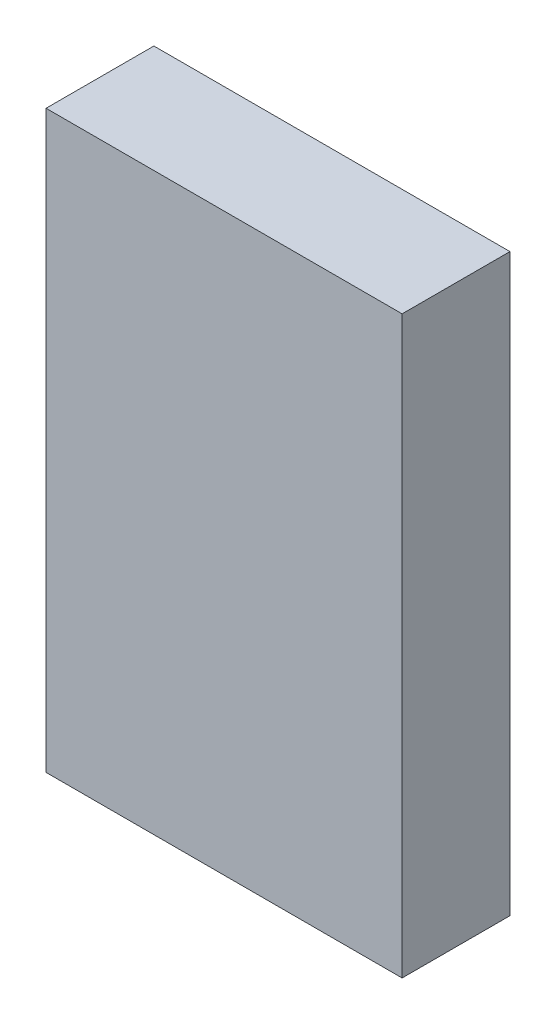
ISO-10303-21;
HEADER;
FILE_DESCRIPTION(('STEP AP214'),'2;1');
FILE_NAME('part.step','',(''),(''),'','','');
FILE_SCHEMA(('AUTOMOTIVE_DESIGN { 1 0 10303 214 1 1 1 1 }'));
ENDSEC;
DATA;
#1=APPLICATION_CONTEXT('core data for automotive mechanical design processes');
#2=APPLICATION_PROTOCOL_DEFINITION('international standard','automotive_design',2000,#1);
#3=PRODUCT_CONTEXT('',#1,'mechanical');
#4=PRODUCT('Part','Part','',(#3));
#5=PRODUCT_RELATED_PRODUCT_CATEGORY('part','',(#4));
#6=PRODUCT_DEFINITION_FORMATION('','',#4);
#7=PRODUCT_DEFINITION_CONTEXT('part definition',#1,'design');
#8=PRODUCT_DEFINITION('design','',#6,#7);
#9=PRODUCT_DEFINITION_SHAPE('','',#8);
#10=(LENGTH_UNIT() NAMED_UNIT(*) SI_UNIT(.MILLI.,.METRE.));
#11=(NAMED_UNIT(*) PLANE_ANGLE_UNIT() SI_UNIT($,.RADIAN.));
#12=(NAMED_UNIT(*) SI_UNIT($,.STERADIAN.) SOLID_ANGLE_UNIT());
#13=UNCERTAINTY_MEASURE_WITH_UNIT(LENGTH_MEASURE(1.E-05),#10,'distance_accuracy_value','');
#14=(GEOMETRIC_REPRESENTATION_CONTEXT(3) GLOBAL_UNCERTAINTY_ASSIGNED_CONTEXT((#13)) GLOBAL_UNIT_ASSIGNED_CONTEXT((#10,
#11,#12)) REPRESENTATION_CONTEXT('',''));
#15=CARTESIAN_POINT('',(0.,0.,0.));
#16=DIRECTION('',(0.,0.,1.));
#17=DIRECTION('',(1.,0.,0.));
#18=AXIS2_PLACEMENT_3D('',#15,#16,#17);
#19=CARTESIAN_POINT('',(-1.651,2.667,1.00000054));
#20=DIRECTION('',(0.,0.,1.));
#21=DIRECTION('',(1.,0.,0.));
#22=AXIS2_PLACEMENT_3D('',#19,#20,#21);
#23=PLANE('',#22);
#24=DIRECTION('',(0.,1.,0.));
#25=VECTOR('',#24,1.);
#26=CARTESIAN_POINT('',(-1.651,-2.667,1.00000054));
#27=LINE('',#26,#25);
#28=CARTESIAN_POINT('',(-1.651,-2.667,1.00000054));
#29=VERTEX_POINT('',#28);
#30=CARTESIAN_POINT('',(-1.651,2.667,1.00000054));
#31=VERTEX_POINT('',#30);
#32=EDGE_CURVE('E26',#29,#31,#27,.T.);
#33=ORIENTED_EDGE('',*,*,#32,.F.);
#34=DIRECTION('',(-1.,0.,0.));
#35=VECTOR('',#34,1.);
#36=CARTESIAN_POINT('',(1.651,-2.667,1.00000054));
#37=LINE('',#36,#35);
#38=CARTESIAN_POINT('',(1.651,-2.667,1.00000054));
#39=VERTEX_POINT('',#38);
#40=EDGE_CURVE('E72',#39,#29,#37,.T.);
#41=ORIENTED_EDGE('',*,*,#40,.F.);
#42=DIRECTION('',(0.,-1.,0.));
#43=VECTOR('',#42,1.);
#44=CARTESIAN_POINT('',(1.651,2.66700254,1.00000054));
#45=LINE('',#44,#43);
#46=CARTESIAN_POINT('',(1.651,2.66700254,1.00000054));
#47=VERTEX_POINT('',#46);
#48=EDGE_CURVE('E19',#47,#39,#45,.T.);
#49=ORIENTED_EDGE('',*,*,#48,.F.);
#50=DIRECTION('',(0.999999999999704,7.69230768320873E-07,0.));
#51=VECTOR('',#50,1.);
#52=CARTESIAN_POINT('',(-1.651,2.667,1.00000054));
#53=LINE('',#52,#51);
#54=EDGE_CURVE('E102',#31,#47,#53,.T.);
#55=ORIENTED_EDGE('',*,*,#54,.F.);
#56=EDGE_LOOP('',(#33,#41,#49,#55));
#57=FACE_BOUND('',#56,.T.);
#58=ADVANCED_FACE('F16',(#57),#23,.T.);
#59=CARTESIAN_POINT('',(-1.651,2.667,0.));
#60=DIRECTION('',(0.,0.,1.));
#61=DIRECTION('',(1.,0.,0.));
#62=AXIS2_PLACEMENT_3D('',#59,#60,#61);
#63=PLANE('',#62);
#64=DIRECTION('',(0.999999999999704,7.69230768320873E-07,0.));
#65=VECTOR('',#64,1.);
#66=CARTESIAN_POINT('',(-1.651,2.667,0.));
#67=LINE('',#66,#65);
#68=CARTESIAN_POINT('',(-1.651,2.667,0.));
#69=VERTEX_POINT('',#68);
#70=CARTESIAN_POINT('',(1.651,2.66700254,0.));
#71=VERTEX_POINT('',#70);
#72=EDGE_CURVE('E91',#69,#71,#67,.T.);
#73=ORIENTED_EDGE('',*,*,#72,.T.);
#74=DIRECTION('',(0.,-1.,0.));
#75=VECTOR('',#74,1.);
#76=CARTESIAN_POINT('',(1.651,2.66700254,0.));
#77=LINE('',#76,#75);
#78=CARTESIAN_POINT('',(1.651,-2.667,0.));
#79=VERTEX_POINT('',#78);
#80=EDGE_CURVE('E65',#71,#79,#77,.T.);
#81=ORIENTED_EDGE('',*,*,#80,.T.);
#82=DIRECTION('',(-1.,0.,0.));
#83=VECTOR('',#82,1.);
#84=CARTESIAN_POINT('',(1.651,-2.667,0.));
#85=LINE('',#84,#83);
#86=CARTESIAN_POINT('',(-1.651,-2.667,0.));
#87=VERTEX_POINT('',#86);
#88=EDGE_CURVE('E83',#79,#87,#85,.T.);
#89=ORIENTED_EDGE('',*,*,#88,.T.);
#90=DIRECTION('',(0.,1.,0.));
#91=VECTOR('',#90,1.);
#92=CARTESIAN_POINT('',(-1.651,-2.667,0.));
#93=LINE('',#92,#91);
#94=EDGE_CURVE('E11',#87,#69,#93,.T.);
#95=ORIENTED_EDGE('',*,*,#94,.T.);
#96=EDGE_LOOP('',(#73,#81,#89,#95));
#97=FACE_BOUND('',#96,.T.);
#98=ADVANCED_FACE('F127',(#97),#63,.F.);
#99=CARTESIAN_POINT('',(-1.651,-2.667,0.));
#100=DIRECTION('',(-1.,0.,0.));
#101=DIRECTION('',(0.,0.,1.));
#102=AXIS2_PLACEMENT_3D('',#99,#100,#101);
#103=PLANE('',#102);
#104=DIRECTION('',(0.,0.,1.));
#105=VECTOR('',#104,1.);
#106=CARTESIAN_POINT('',(-1.651,-2.667,0.));
#107=LINE('',#106,#105);
#108=EDGE_CURVE('E79',#87,#29,#107,.T.);
#109=ORIENTED_EDGE('',*,*,#108,.T.);
#110=ORIENTED_EDGE('',*,*,#32,.T.);
#111=DIRECTION('',(0.,0.,1.));
#112=VECTOR('',#111,1.);
#113=CARTESIAN_POINT('',(-1.651,2.667,0.));
#114=LINE('',#113,#112);
#115=EDGE_CURVE('E117',#69,#31,#114,.T.);
#116=ORIENTED_EDGE('',*,*,#115,.F.);
#117=ORIENTED_EDGE('',*,*,#94,.F.);
#118=EDGE_LOOP('',(#109,#110,#116,#117));
#119=FACE_BOUND('',#118,.T.);
#120=ADVANCED_FACE('F125',(#119),#103,.T.);
#121=CARTESIAN_POINT('',(1.651,-2.667,0.));
#122=DIRECTION('',(0.,-1.,0.));
#123=DIRECTION('',(0.,0.,-1.));
#124=AXIS2_PLACEMENT_3D('',#121,#122,#123);
#125=PLANE('',#124);
#126=DIRECTION('',(0.,0.,1.));
#127=VECTOR('',#126,1.);
#128=CARTESIAN_POINT('',(1.651,-2.667,0.));
#129=LINE('',#128,#127);
#130=EDGE_CURVE('E81',#79,#39,#129,.T.);
#131=ORIENTED_EDGE('',*,*,#130,.T.);
#132=ORIENTED_EDGE('',*,*,#40,.T.);
#133=ORIENTED_EDGE('',*,*,#108,.F.);
#134=ORIENTED_EDGE('',*,*,#88,.F.);
#135=EDGE_LOOP('',(#131,#132,#133,#134));
#136=FACE_BOUND('',#135,.T.);
#137=ADVANCED_FACE('F82',(#136),#125,.T.);
#138=CARTESIAN_POINT('',(1.651,2.66700254,0.));
#139=DIRECTION('',(1.,0.,0.));
#140=DIRECTION('',(0.,1.,0.));
#141=AXIS2_PLACEMENT_3D('',#138,#139,#140);
#142=PLANE('',#141);
#143=DIRECTION('',(0.,0.,1.));
#144=VECTOR('',#143,1.);
#145=CARTESIAN_POINT('',(1.651,2.66700254,0.));
#146=LINE('',#145,#144);
#147=EDGE_CURVE('E88',#71,#47,#146,.T.);
#148=ORIENTED_EDGE('',*,*,#147,.T.);
#149=ORIENTED_EDGE('',*,*,#48,.T.);
#150=ORIENTED_EDGE('',*,*,#130,.F.);
#151=ORIENTED_EDGE('',*,*,#80,.F.);
#152=EDGE_LOOP('',(#148,#149,#150,#151));
#153=FACE_BOUND('',#152,.T.);
#154=ADVANCED_FACE('F86',(#153),#142,.T.);
#155=CARTESIAN_POINT('',(-1.651,2.667,0.));
#156=DIRECTION('',(-7.69230768320873E-07,0.999999999999704,0.));
#157=DIRECTION('',(0.,0.,1.));
#158=AXIS2_PLACEMENT_3D('',#155,#156,#157);
#159=PLANE('',#158);
#160=ORIENTED_EDGE('',*,*,#115,.T.);
#161=ORIENTED_EDGE('',*,*,#54,.T.);
#162=ORIENTED_EDGE('',*,*,#147,.F.);
#163=ORIENTED_EDGE('',*,*,#72,.F.);
#164=EDGE_LOOP('',(#160,#161,#162,#163));
#165=FACE_BOUND('',#164,.T.);
#166=ADVANCED_FACE('F124',(#165),#159,.T.);
#167=CLOSED_SHELL('',(#58,#98,#120,#137,#154,#166));
#168=MANIFOLD_SOLID_BREP('B1',#167);
#169=ADVANCED_BREP_SHAPE_REPRESENTATION('',(#18,#168),#14);
#170=SHAPE_DEFINITION_REPRESENTATION(#9,#169);
ENDSEC;
END-ISO-10303-21;
